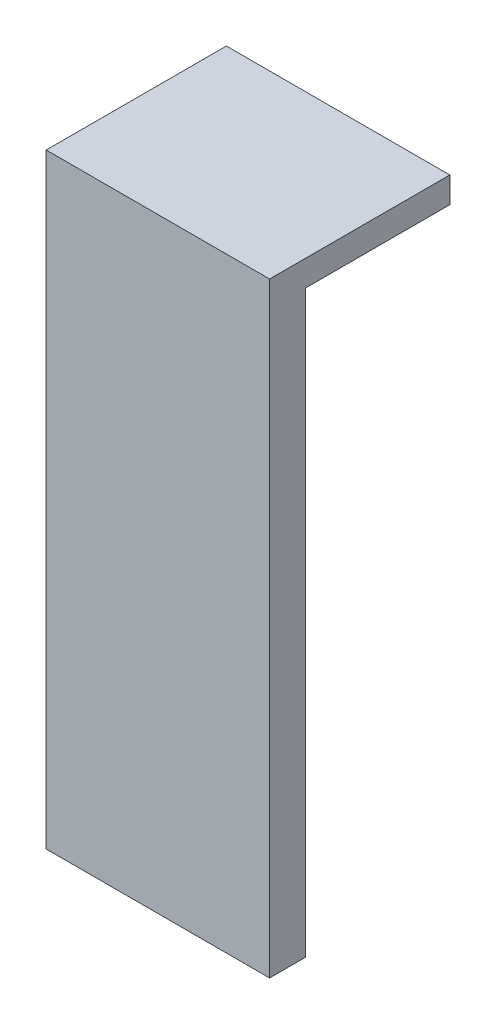
ISO-10303-21;
HEADER;
FILE_DESCRIPTION(('STEP AP214'),'2;1');
FILE_NAME('part.step','',(''),(''),'','','');
FILE_SCHEMA(('AUTOMOTIVE_DESIGN { 1 0 10303 214 1 1 1 1 }'));
ENDSEC;
DATA;
#1=APPLICATION_CONTEXT('core data for automotive mechanical design processes');
#2=APPLICATION_PROTOCOL_DEFINITION('international standard','automotive_design',2000,#1);
#3=PRODUCT_CONTEXT('',#1,'mechanical');
#4=PRODUCT('Part','Part','',(#3));
#5=PRODUCT_RELATED_PRODUCT_CATEGORY('part','',(#4));
#6=PRODUCT_DEFINITION_FORMATION('','',#4);
#7=PRODUCT_DEFINITION_CONTEXT('part definition',#1,'design');
#8=PRODUCT_DEFINITION('design','',#6,#7);
#9=PRODUCT_DEFINITION_SHAPE('','',#8);
#10=(LENGTH_UNIT() NAMED_UNIT(*) SI_UNIT(.MILLI.,.METRE.));
#11=(NAMED_UNIT(*) PLANE_ANGLE_UNIT() SI_UNIT($,.RADIAN.));
#12=(NAMED_UNIT(*) SI_UNIT($,.STERADIAN.) SOLID_ANGLE_UNIT());
#13=UNCERTAINTY_MEASURE_WITH_UNIT(LENGTH_MEASURE(1.E-05),#10,'distance_accuracy_value','');
#14=(GEOMETRIC_REPRESENTATION_CONTEXT(3) GLOBAL_UNCERTAINTY_ASSIGNED_CONTEXT((#13)) GLOBAL_UNIT_ASSIGNED_CONTEXT((#10,
#11,#12)) REPRESENTATION_CONTEXT('',''));
#15=CARTESIAN_POINT('',(0.,0.,0.));
#16=DIRECTION('',(0.,0.,1.));
#17=DIRECTION('',(1.,0.,0.));
#18=AXIS2_PLACEMENT_3D('',#15,#16,#17);
#19=CARTESIAN_POINT('',(-4.2545,21.336,-1.27));
#20=DIRECTION('',(0.,0.,1.));
#21=DIRECTION('',(1.,0.,0.));
#22=AXIS2_PLACEMENT_3D('',#19,#20,#21);
#23=PLANE('',#22);
#24=DIRECTION('',(-1.,0.,0.));
#25=VECTOR('',#24,1.);
#26=CARTESIAN_POINT('',(3.6195,20.42775542234,-1.27));
#27=LINE('',#26,#25);
#28=CARTESIAN_POINT('',(3.61949999999999,20.42775542234,-1.27));
#29=VERTEX_POINT('',#28);
#30=CARTESIAN_POINT('',(-4.2545,20.42775542234,-1.27));
#31=VERTEX_POINT('',#30);
#32=EDGE_CURVE('E48',#29,#31,#27,.T.);
#33=ORIENTED_EDGE('',*,*,#32,.F.);
#34=DIRECTION('',(0.,-1.,0.));
#35=VECTOR('',#34,1.);
#36=CARTESIAN_POINT('',(3.61949999999999,21.336,-1.27));
#37=LINE('',#36,#35);
#38=CARTESIAN_POINT('',(3.61949999999999,0.,-1.27));
#39=VERTEX_POINT('',#38);
#40=EDGE_CURVE('E84',#29,#39,#37,.T.);
#41=ORIENTED_EDGE('',*,*,#40,.T.);
#42=DIRECTION('',(-1.,0.,0.));
#43=VECTOR('',#42,1.);
#44=CARTESIAN_POINT('',(-4.2545,0.,-1.27));
#45=LINE('',#44,#43);
#46=CARTESIAN_POINT('',(-4.2545,0.,-1.27));
#47=VERTEX_POINT('',#46);
#48=EDGE_CURVE('E88',#39,#47,#45,.T.);
#49=ORIENTED_EDGE('',*,*,#48,.T.);
#50=DIRECTION('',(0.,-1.,0.));
#51=VECTOR('',#50,1.);
#52=CARTESIAN_POINT('',(-4.2545,21.336,-1.27));
#53=LINE('',#52,#51);
#54=EDGE_CURVE('E75',#31,#47,#53,.T.);
#55=ORIENTED_EDGE('',*,*,#54,.F.);
#56=EDGE_LOOP('',(#33,#41,#49,#55));
#57=FACE_BOUND('',#56,.T.);
#58=ADVANCED_FACE('F33',(#57),#23,.F.);
#59=CARTESIAN_POINT('',(-4.2545,21.336,-1.27));
#60=DIRECTION('',(1.,0.,0.));
#61=DIRECTION('',(0.,0.,-1.));
#62=AXIS2_PLACEMENT_3D('',#59,#60,#61);
#63=PLANE('',#62);
#64=DIRECTION('',(0.,0.,1.));
#65=VECTOR('',#64,1.);
#66=CARTESIAN_POINT('',(-4.2545,0.,-1.27));
#67=LINE('',#66,#65);
#68=CARTESIAN_POINT('',(-4.2545,0.,0.));
#69=VERTEX_POINT('',#68);
#70=EDGE_CURVE('E79',#47,#69,#67,.T.);
#71=ORIENTED_EDGE('',*,*,#70,.T.);
#72=DIRECTION('',(0.,-1.,0.));
#73=VECTOR('',#72,1.);
#74=CARTESIAN_POINT('',(-4.2545,21.336,0.));
#75=LINE('',#74,#73);
#76=CARTESIAN_POINT('',(-4.2545,21.336,0.));
#77=VERTEX_POINT('',#76);
#78=EDGE_CURVE('E11',#77,#69,#75,.T.);
#79=ORIENTED_EDGE('',*,*,#78,.F.);
#80=DIRECTION('',(0.,0.,1.));
#81=VECTOR('',#80,1.);
#82=CARTESIAN_POINT('',(-4.2545,21.336,-1.27));
#83=LINE('',#82,#81);
#84=CARTESIAN_POINT('',(-4.25450000000001,21.336,-6.35));
#85=VERTEX_POINT('',#84);
#86=EDGE_CURVE('E92',#85,#77,#83,.T.);
#87=ORIENTED_EDGE('',*,*,#86,.F.);
#88=DIRECTION('',(0.,1.,0.));
#89=VECTOR('',#88,1.);
#90=CARTESIAN_POINT('',(-4.25450000000001,21.336,-6.35));
#91=LINE('',#90,#89);
#92=CARTESIAN_POINT('',(-4.25450000000001,20.42775542234,-6.35));
#93=VERTEX_POINT('',#92);
#94=EDGE_CURVE('E117',#93,#85,#91,.T.);
#95=ORIENTED_EDGE('',*,*,#94,.F.);
#96=DIRECTION('',(0.,0.,1.));
#97=VECTOR('',#96,1.);
#98=CARTESIAN_POINT('',(-4.25450000000001,20.42775542234,-6.35));
#99=LINE('',#98,#97);
#100=EDGE_CURVE('E83',#93,#31,#99,.T.);
#101=ORIENTED_EDGE('',*,*,#100,.T.);
#102=ORIENTED_EDGE('',*,*,#54,.T.);
#103=EDGE_LOOP('',(#71,#79,#87,#95,#101,#102));
#104=FACE_BOUND('',#103,.T.);
#105=ADVANCED_FACE('F35',(#104),#63,.F.);
#106=CARTESIAN_POINT('',(-4.2545,21.336,0.));
#107=DIRECTION('',(0.,0.,-1.));
#108=DIRECTION('',(-1.,0.,0.));
#109=AXIS2_PLACEMENT_3D('',#106,#107,#108);
#110=PLANE('',#109);
#111=DIRECTION('',(1.,0.,0.));
#112=VECTOR('',#111,1.);
#113=CARTESIAN_POINT('',(-4.2545,0.,0.));
#114=LINE('',#113,#112);
#115=CARTESIAN_POINT('',(3.6195,0.,0.));
#116=VERTEX_POINT('',#115);
#117=EDGE_CURVE('E96',#69,#116,#114,.T.);
#118=ORIENTED_EDGE('',*,*,#117,.T.);
#119=DIRECTION('',(0.,-1.,0.));
#120=VECTOR('',#119,1.);
#121=CARTESIAN_POINT('',(3.6195,21.336,0.));
#122=LINE('',#121,#120);
#123=CARTESIAN_POINT('',(3.6195,21.336,0.));
#124=VERTEX_POINT('',#123);
#125=EDGE_CURVE('E41',#124,#116,#122,.T.);
#126=ORIENTED_EDGE('',*,*,#125,.F.);
#127=DIRECTION('',(1.,0.,0.));
#128=VECTOR('',#127,1.);
#129=CARTESIAN_POINT('',(-4.2545,21.336,0.));
#130=LINE('',#129,#128);
#131=EDGE_CURVE('E57',#77,#124,#130,.T.);
#132=ORIENTED_EDGE('',*,*,#131,.F.);
#133=ORIENTED_EDGE('',*,*,#78,.T.);
#134=EDGE_LOOP('',(#118,#126,#132,#133));
#135=FACE_BOUND('',#134,.T.);
#136=ADVANCED_FACE('F112',(#135),#110,.F.);
#137=CARTESIAN_POINT('',(3.61949999999999,21.336,-1.27));
#138=DIRECTION('',(-1.,0.,0.));
#139=DIRECTION('',(0.,0.,1.));
#140=AXIS2_PLACEMENT_3D('',#137,#138,#139);
#141=PLANE('',#140);
#142=DIRECTION('',(0.,0.,-1.));
#143=VECTOR('',#142,1.);
#144=CARTESIAN_POINT('',(3.61949999999999,0.,-1.27));
#145=LINE('',#144,#143);
#146=EDGE_CURVE('E93',#116,#39,#145,.T.);
#147=ORIENTED_EDGE('',*,*,#146,.T.);
#148=ORIENTED_EDGE('',*,*,#40,.F.);
#149=DIRECTION('',(0.,0.,1.));
#150=VECTOR('',#149,1.);
#151=CARTESIAN_POINT('',(3.61949999999999,20.42775542234,-6.35));
#152=LINE('',#151,#150);
#153=CARTESIAN_POINT('',(3.61949999999999,20.42775542234,-6.35));
#154=VERTEX_POINT('',#153);
#155=EDGE_CURVE('E97',#154,#29,#152,.T.);
#156=ORIENTED_EDGE('',*,*,#155,.F.);
#157=DIRECTION('',(0.,-1.,0.));
#158=VECTOR('',#157,1.);
#159=CARTESIAN_POINT('',(3.61949999999999,21.336,-6.35));
#160=LINE('',#159,#158);
#161=CARTESIAN_POINT('',(3.61949999999999,21.336,-6.35));
#162=VERTEX_POINT('',#161);
#163=EDGE_CURVE('E135',#162,#154,#160,.T.);
#164=ORIENTED_EDGE('',*,*,#163,.F.);
#165=DIRECTION('',(0.,0.,-1.));
#166=VECTOR('',#165,1.);
#167=CARTESIAN_POINT('',(3.61949999999999,21.336,-1.27));
#168=LINE('',#167,#166);
#169=EDGE_CURVE('E85',#124,#162,#168,.T.);
#170=ORIENTED_EDGE('',*,*,#169,.F.);
#171=ORIENTED_EDGE('',*,*,#125,.T.);
#172=EDGE_LOOP('',(#147,#148,#156,#164,#170,#171));
#173=FACE_BOUND('',#172,.T.);
#174=ADVANCED_FACE('F109',(#173),#141,.F.);
#175=CARTESIAN_POINT('',(0.,21.336,0.));
#176=DIRECTION('',(0.,1.,0.));
#177=DIRECTION('',(0.,0.,1.));
#178=AXIS2_PLACEMENT_3D('',#175,#176,#177);
#179=PLANE('',#178);
#180=ORIENTED_EDGE('',*,*,#86,.T.);
#181=ORIENTED_EDGE('',*,*,#131,.T.);
#182=ORIENTED_EDGE('',*,*,#169,.T.);
#183=DIRECTION('',(1.,0.,0.));
#184=VECTOR('',#183,1.);
#185=CARTESIAN_POINT('',(3.61949999999999,21.336,-6.35));
#186=LINE('',#185,#184);
#187=EDGE_CURVE('E126',#85,#162,#186,.T.);
#188=ORIENTED_EDGE('',*,*,#187,.F.);
#189=EDGE_LOOP('',(#180,#181,#182,#188));
#190=FACE_BOUND('',#189,.T.);
#191=ADVANCED_FACE('F130',(#190),#179,.T.);
#192=CARTESIAN_POINT('',(0.,0.,0.));
#193=DIRECTION('',(0.,1.,0.));
#194=DIRECTION('',(0.,0.,1.));
#195=AXIS2_PLACEMENT_3D('',#192,#193,#194);
#196=PLANE('',#195);
#197=ORIENTED_EDGE('',*,*,#70,.F.);
#198=ORIENTED_EDGE('',*,*,#48,.F.);
#199=ORIENTED_EDGE('',*,*,#146,.F.);
#200=ORIENTED_EDGE('',*,*,#117,.F.);
#201=EDGE_LOOP('',(#197,#198,#199,#200));
#202=FACE_BOUND('',#201,.T.);
#203=ADVANCED_FACE('F95',(#202),#196,.F.);
#204=CARTESIAN_POINT('',(3.61949999999999,20.42775542234,-6.35));
#205=DIRECTION('',(0.,1.,0.));
#206=DIRECTION('',(0.,0.,1.));
#207=AXIS2_PLACEMENT_3D('',#204,#205,#206);
#208=PLANE('',#207);
#209=ORIENTED_EDGE('',*,*,#32,.T.);
#210=ORIENTED_EDGE('',*,*,#100,.F.);
#211=DIRECTION('',(-1.,0.,0.));
#212=VECTOR('',#211,1.);
#213=CARTESIAN_POINT('',(3.61949999999999,20.42775542234,-6.35));
#214=LINE('',#213,#212);
#215=EDGE_CURVE('E128',#154,#93,#214,.T.);
#216=ORIENTED_EDGE('',*,*,#215,.F.);
#217=ORIENTED_EDGE('',*,*,#155,.T.);
#218=EDGE_LOOP('',(#209,#210,#216,#217));
#219=FACE_BOUND('',#218,.T.);
#220=ADVANCED_FACE('F141',(#219),#208,.F.);
#221=CARTESIAN_POINT('',(0.,0.,-6.35));
#222=DIRECTION('',(0.,0.,-1.));
#223=DIRECTION('',(-1.,0.,0.));
#224=AXIS2_PLACEMENT_3D('',#221,#222,#223);
#225=PLANE('',#224);
#226=ORIENTED_EDGE('',*,*,#163,.T.);
#227=ORIENTED_EDGE('',*,*,#215,.T.);
#228=ORIENTED_EDGE('',*,*,#94,.T.);
#229=ORIENTED_EDGE('',*,*,#187,.T.);
#230=EDGE_LOOP('',(#226,#227,#228,#229));
#231=FACE_BOUND('',#230,.T.);
#232=ADVANCED_FACE('F125',(#231),#225,.T.);
#233=CLOSED_SHELL('',(#58,#105,#136,#174,#191,#203,#220,#232));
#234=MANIFOLD_SOLID_BREP('B2',#233);
#235=ADVANCED_BREP_SHAPE_REPRESENTATION('',(#18,#234),#14);
#236=SHAPE_DEFINITION_REPRESENTATION(#9,#235);
ENDSEC;
END-ISO-10303-21;
